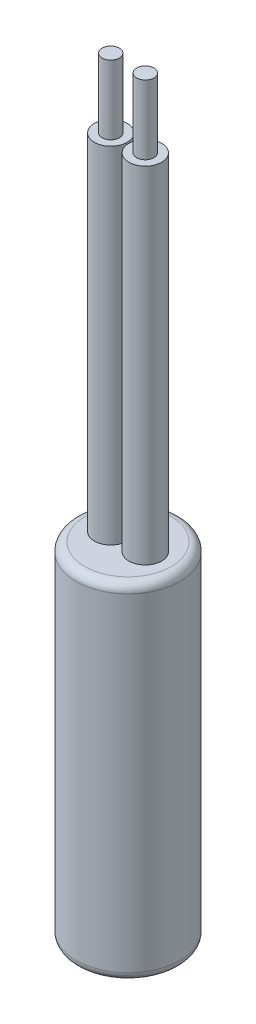
ISO-10303-21;
HEADER;
FILE_DESCRIPTION(('STEP AP214'),'2;1');
FILE_NAME('part.step','',(''),(''),'','','');
FILE_SCHEMA(('AUTOMOTIVE_DESIGN { 1 0 10303 214 1 1 1 1 }'));
ENDSEC;
DATA;
#1=APPLICATION_CONTEXT('core data for automotive mechanical design processes');
#2=APPLICATION_PROTOCOL_DEFINITION('international standard','automotive_design',2000,#1);
#3=PRODUCT_CONTEXT('',#1,'mechanical');
#4=PRODUCT('Part','Part','',(#3));
#5=PRODUCT_RELATED_PRODUCT_CATEGORY('part','',(#4));
#6=PRODUCT_DEFINITION_FORMATION('','',#4);
#7=PRODUCT_DEFINITION_CONTEXT('part definition',#1,'design');
#8=PRODUCT_DEFINITION('design','',#6,#7);
#9=PRODUCT_DEFINITION_SHAPE('','',#8);
#10=(LENGTH_UNIT() NAMED_UNIT(*) SI_UNIT(.MILLI.,.METRE.));
#11=(NAMED_UNIT(*) PLANE_ANGLE_UNIT() SI_UNIT($,.RADIAN.));
#12=(NAMED_UNIT(*) SI_UNIT($,.STERADIAN.) SOLID_ANGLE_UNIT());
#13=UNCERTAINTY_MEASURE_WITH_UNIT(LENGTH_MEASURE(1.E-05),#10,'distance_accuracy_value','');
#14=(GEOMETRIC_REPRESENTATION_CONTEXT(3) GLOBAL_UNCERTAINTY_ASSIGNED_CONTEXT((#13)) GLOBAL_UNIT_ASSIGNED_CONTEXT((#10,
#11,#12)) REPRESENTATION_CONTEXT('',''));
#15=CARTESIAN_POINT('',(0.,0.,0.));
#16=DIRECTION('',(0.,0.,1.));
#17=DIRECTION('',(1.,0.,0.));
#18=AXIS2_PLACEMENT_3D('',#15,#16,#17);
#19=CARTESIAN_POINT('',(0.,19.5,0.));
#20=DIRECTION('',(0.,-1.,0.));
#21=DIRECTION('',(0.,0.,-1.));
#22=AXIS2_PLACEMENT_3D('',#19,#20,#21);
#23=TOROIDAL_SURFACE('',#22,2.5,0.5);
#24=CARTESIAN_POINT('',(0.,19.5,0.));
#25=DIRECTION('',(0.,-1.,0.));
#26=DIRECTION('',(0.,0.,-1.));
#27=AXIS2_PLACEMENT_3D('',#24,#25,#26);
#28=CIRCLE('',#27,3.);
#29=CARTESIAN_POINT('',(0.,19.5,-3.));
#30=VERTEX_POINT('',#29);
#31=EDGE_CURVE('E123',#30,#30,#28,.T.);
#32=ORIENTED_EDGE('',*,*,#31,.F.);
#33=EDGE_LOOP('',(#32));
#34=FACE_BOUND('',#33,.T.);
#35=CARTESIAN_POINT('',(0.,20.,0.));
#36=DIRECTION('',(0.,1.,0.));
#37=DIRECTION('',(0.,0.,-1.));
#38=AXIS2_PLACEMENT_3D('',#35,#36,#37);
#39=CIRCLE('',#38,2.5);
#40=CARTESIAN_POINT('',(0.,20.,-2.5));
#41=VERTEX_POINT('',#40);
#42=EDGE_CURVE('E116',#41,#41,#39,.T.);
#43=ORIENTED_EDGE('',*,*,#42,.F.);
#44=EDGE_LOOP('',(#43));
#45=FACE_BOUND('',#44,.T.);
#46=ADVANCED_FACE('F16',(#34,#45),#23,.T.);
#47=CARTESIAN_POINT('',(0.,0.5,0.));
#48=DIRECTION('',(0.,-1.,0.));
#49=DIRECTION('',(0.,0.,-1.));
#50=AXIS2_PLACEMENT_3D('',#47,#48,#49);
#51=TOROIDAL_SURFACE('',#50,2.5,0.5);
#52=CARTESIAN_POINT('',(0.,0.,0.));
#53=DIRECTION('',(0.,-1.,0.));
#54=DIRECTION('',(0.,0.,-1.));
#55=AXIS2_PLACEMENT_3D('',#52,#53,#54);
#56=CIRCLE('',#55,2.5);
#57=CARTESIAN_POINT('',(0.,0.,-2.5));
#58=VERTEX_POINT('',#57);
#59=EDGE_CURVE('E85',#58,#58,#56,.T.);
#60=ORIENTED_EDGE('',*,*,#59,.F.);
#61=EDGE_LOOP('',(#60));
#62=FACE_BOUND('',#61,.T.);
#63=CARTESIAN_POINT('',(0.,0.5,0.));
#64=DIRECTION('',(0.,1.,0.));
#65=DIRECTION('',(0.,0.,-1.));
#66=AXIS2_PLACEMENT_3D('',#63,#64,#65);
#67=CIRCLE('',#66,3.);
#68=CARTESIAN_POINT('',(0.,0.5,-3.));
#69=VERTEX_POINT('',#68);
#70=EDGE_CURVE('E119',#69,#69,#67,.T.);
#71=ORIENTED_EDGE('',*,*,#70,.F.);
#72=EDGE_LOOP('',(#71));
#73=FACE_BOUND('',#72,.T.);
#74=ADVANCED_FACE('F151',(#62,#73),#51,.T.);
#75=CARTESIAN_POINT('',(1.,44.,0.));
#76=DIRECTION('',(0.,-1.,0.));
#77=DIRECTION('',(0.,0.,-1.));
#78=AXIS2_PLACEMENT_3D('',#75,#76,#77);
#79=PLANE('',#78);
#80=CARTESIAN_POINT('',(1.,44.,0.));
#81=DIRECTION('',(0.,-1.,0.));
#82=DIRECTION('',(-1.,0.,0.));
#83=AXIS2_PLACEMENT_3D('',#80,#81,#82);
#84=CIRCLE('',#83,0.5);
#85=CARTESIAN_POINT('',(0.5,44.,0.));
#86=VERTEX_POINT('',#85);
#87=EDGE_CURVE('E10',#86,#86,#84,.T.);
#88=ORIENTED_EDGE('',*,*,#87,.F.);
#89=EDGE_LOOP('',(#88));
#90=FACE_BOUND('',#89,.T.);
#91=ADVANCED_FACE('F157',(#90),#79,.F.);
#92=CARTESIAN_POINT('',(1.,44.,0.));
#93=DIRECTION('',(0.,-1.,0.));
#94=DIRECTION('',(0.,0.,-1.));
#95=AXIS2_PLACEMENT_3D('',#92,#93,#94);
#96=CYLINDRICAL_SURFACE('',#95,0.5);
#97=CARTESIAN_POINT('',(1.,40.,0.));
#98=DIRECTION('',(0.,-1.,0.));
#99=DIRECTION('',(-1.,0.,0.));
#100=AXIS2_PLACEMENT_3D('',#97,#98,#99);
#101=CIRCLE('',#100,0.5);
#102=CARTESIAN_POINT('',(0.5,40.,0.));
#103=VERTEX_POINT('',#102);
#104=EDGE_CURVE('E84',#103,#103,#101,.T.);
#105=ORIENTED_EDGE('',*,*,#104,.F.);
#106=EDGE_LOOP('',(#105));
#107=FACE_BOUND('',#106,.T.);
#108=ORIENTED_EDGE('',*,*,#87,.T.);
#109=EDGE_LOOP('',(#108));
#110=FACE_BOUND('',#109,.T.);
#111=ADVANCED_FACE('F176',(#107,#110),#96,.T.);
#112=CARTESIAN_POINT('',(-1.,44.,0.));
#113=DIRECTION('',(0.,-1.,0.));
#114=DIRECTION('',(0.,0.,-1.));
#115=AXIS2_PLACEMENT_3D('',#112,#113,#114);
#116=PLANE('',#115);
#117=CARTESIAN_POINT('',(-1.,44.,0.));
#118=DIRECTION('',(0.,-1.,0.));
#119=DIRECTION('',(-1.,0.,0.));
#120=AXIS2_PLACEMENT_3D('',#117,#118,#119);
#121=CIRCLE('',#120,0.5);
#122=CARTESIAN_POINT('',(-1.5,44.,0.));
#123=VERTEX_POINT('',#122);
#124=EDGE_CURVE('E25',#123,#123,#121,.T.);
#125=ORIENTED_EDGE('',*,*,#124,.F.);
#126=EDGE_LOOP('',(#125));
#127=FACE_BOUND('',#126,.T.);
#128=ADVANCED_FACE('F179',(#127),#116,.F.);
#129=CARTESIAN_POINT('',(-1.,44.,0.));
#130=DIRECTION('',(0.,-1.,0.));
#131=DIRECTION('',(0.,0.,-1.));
#132=AXIS2_PLACEMENT_3D('',#129,#130,#131);
#133=CYLINDRICAL_SURFACE('',#132,0.5);
#134=CARTESIAN_POINT('',(-1.,40.,0.));
#135=DIRECTION('',(0.,-1.,0.));
#136=DIRECTION('',(-1.,0.,0.));
#137=AXIS2_PLACEMENT_3D('',#134,#135,#136);
#138=CIRCLE('',#137,0.5);
#139=CARTESIAN_POINT('',(-1.5,40.,0.));
#140=VERTEX_POINT('',#139);
#141=EDGE_CURVE('E19',#140,#140,#138,.T.);
#142=ORIENTED_EDGE('',*,*,#141,.F.);
#143=EDGE_LOOP('',(#142));
#144=FACE_BOUND('',#143,.T.);
#145=ORIENTED_EDGE('',*,*,#124,.T.);
#146=EDGE_LOOP('',(#145));
#147=FACE_BOUND('',#146,.T.);
#148=ADVANCED_FACE('F147',(#144,#147),#133,.T.);
#149=CARTESIAN_POINT('',(-1.,40.,0.));
#150=DIRECTION('',(0.,-1.,0.));
#151=DIRECTION('',(0.,0.,-1.));
#152=AXIS2_PLACEMENT_3D('',#149,#150,#151);
#153=PLANE('',#152);
#154=CARTESIAN_POINT('',(-1.,40.,0.));
#155=DIRECTION('',(0.,-1.,0.));
#156=DIRECTION('',(-1.,0.,0.));
#157=AXIS2_PLACEMENT_3D('',#154,#155,#156);
#158=CIRCLE('',#157,0.95);
#159=CARTESIAN_POINT('',(-1.95,40.,0.));
#160=VERTEX_POINT('',#159);
#161=EDGE_CURVE('E91',#160,#160,#158,.T.);
#162=ORIENTED_EDGE('',*,*,#161,.F.);
#163=EDGE_LOOP('',(#162));
#164=FACE_BOUND('',#163,.T.);
#165=ORIENTED_EDGE('',*,*,#141,.T.);
#166=EDGE_LOOP('',(#165));
#167=FACE_BOUND('',#166,.T.);
#168=ADVANCED_FACE('F139',(#164,#167),#153,.F.);
#169=CARTESIAN_POINT('',(-1.,40.,0.));
#170=DIRECTION('',(0.,-1.,0.));
#171=DIRECTION('',(0.,0.,-1.));
#172=AXIS2_PLACEMENT_3D('',#169,#170,#171);
#173=CYLINDRICAL_SURFACE('',#172,0.95);
#174=CARTESIAN_POINT('',(-1.,20.,0.));
#175=DIRECTION('',(0.,-1.,0.));
#176=DIRECTION('',(-1.,0.,0.));
#177=AXIS2_PLACEMENT_3D('',#174,#175,#176);
#178=CIRCLE('',#177,0.95);
#179=CARTESIAN_POINT('',(-1.95,20.,0.));
#180=VERTEX_POINT('',#179);
#181=EDGE_CURVE('E114',#180,#180,#178,.T.);
#182=ORIENTED_EDGE('',*,*,#181,.F.);
#183=EDGE_LOOP('',(#182));
#184=FACE_BOUND('',#183,.T.);
#185=ORIENTED_EDGE('',*,*,#161,.T.);
#186=EDGE_LOOP('',(#185));
#187=FACE_BOUND('',#186,.T.);
#188=ADVANCED_FACE('F136',(#184,#187),#173,.T.);
#189=CARTESIAN_POINT('',(1.,40.,0.));
#190=DIRECTION('',(0.,-1.,0.));
#191=DIRECTION('',(0.,0.,-1.));
#192=AXIS2_PLACEMENT_3D('',#189,#190,#191);
#193=PLANE('',#192);
#194=CARTESIAN_POINT('',(1.,40.,0.));
#195=DIRECTION('',(0.,-1.,0.));
#196=DIRECTION('',(-1.,0.,0.));
#197=AXIS2_PLACEMENT_3D('',#194,#195,#196);
#198=CIRCLE('',#197,0.95);
#199=CARTESIAN_POINT('',(0.05,40.,0.));
#200=VERTEX_POINT('',#199);
#201=EDGE_CURVE('E80',#200,#200,#198,.T.);
#202=ORIENTED_EDGE('',*,*,#201,.F.);
#203=EDGE_LOOP('',(#202));
#204=FACE_BOUND('',#203,.T.);
#205=ORIENTED_EDGE('',*,*,#104,.T.);
#206=EDGE_LOOP('',(#205));
#207=FACE_BOUND('',#206,.T.);
#208=ADVANCED_FACE('F138',(#204,#207),#193,.F.);
#209=CARTESIAN_POINT('',(1.,40.,0.));
#210=DIRECTION('',(0.,-1.,0.));
#211=DIRECTION('',(0.,0.,-1.));
#212=AXIS2_PLACEMENT_3D('',#209,#210,#211);
#213=CYLINDRICAL_SURFACE('',#212,0.95);
#214=CARTESIAN_POINT('',(1.,20.,0.));
#215=DIRECTION('',(0.,-1.,0.));
#216=DIRECTION('',(-1.,0.,0.));
#217=AXIS2_PLACEMENT_3D('',#214,#215,#216);
#218=CIRCLE('',#217,0.95);
#219=CARTESIAN_POINT('',(0.05,20.,0.));
#220=VERTEX_POINT('',#219);
#221=EDGE_CURVE('E94',#220,#220,#218,.T.);
#222=ORIENTED_EDGE('',*,*,#221,.F.);
#223=EDGE_LOOP('',(#222));
#224=FACE_BOUND('',#223,.T.);
#225=ORIENTED_EDGE('',*,*,#201,.T.);
#226=EDGE_LOOP('',(#225));
#227=FACE_BOUND('',#226,.T.);
#228=ADVANCED_FACE('F81',(#224,#227),#213,.T.);
#229=CARTESIAN_POINT('',(0.,0.,0.));
#230=DIRECTION('',(0.,-1.,0.));
#231=DIRECTION('',(0.,0.,-1.));
#232=AXIS2_PLACEMENT_3D('',#229,#230,#231);
#233=PLANE('',#232);
#234=ORIENTED_EDGE('',*,*,#59,.T.);
#235=EDGE_LOOP('',(#234));
#236=FACE_BOUND('',#235,.T.);
#237=ADVANCED_FACE('F164',(#236),#233,.T.);
#238=CARTESIAN_POINT('',(0.,20.,0.));
#239=DIRECTION('',(0.,-1.,0.));
#240=DIRECTION('',(0.,0.,-1.));
#241=AXIS2_PLACEMENT_3D('',#238,#239,#240);
#242=PLANE('',#241);
#243=ORIENTED_EDGE('',*,*,#221,.T.);
#244=EDGE_LOOP('',(#243));
#245=FACE_BOUND('',#244,.T.);
#246=ORIENTED_EDGE('',*,*,#181,.T.);
#247=EDGE_LOOP('',(#246));
#248=FACE_BOUND('',#247,.T.);
#249=ORIENTED_EDGE('',*,*,#42,.T.);
#250=EDGE_LOOP('',(#249));
#251=FACE_BOUND('',#250,.T.);
#252=ADVANCED_FACE('F133',(#245,#248,#251),#242,.F.);
#253=CARTESIAN_POINT('',(0.,20.,0.));
#254=DIRECTION('',(0.,-1.,0.));
#255=DIRECTION('',(0.,0.,-1.));
#256=AXIS2_PLACEMENT_3D('',#253,#254,#255);
#257=CYLINDRICAL_SURFACE('',#256,3.);
#258=ORIENTED_EDGE('',*,*,#70,.T.);
#259=EDGE_LOOP('',(#258));
#260=FACE_BOUND('',#259,.T.);
#261=ORIENTED_EDGE('',*,*,#31,.T.);
#262=EDGE_LOOP('',(#261));
#263=FACE_BOUND('',#262,.T.);
#264=ADVANCED_FACE('F163',(#260,#263),#257,.T.);
#265=CLOSED_SHELL('',(#46,#74,#91,#111,#128,#148,#168,#188,#208,#228,#237,#252,#264));
#266=MANIFOLD_SOLID_BREP('B1',#265);
#267=ADVANCED_BREP_SHAPE_REPRESENTATION('',(#18,#266),#14);
#268=SHAPE_DEFINITION_REPRESENTATION(#9,#267);
ENDSEC;
END-ISO-10303-21;
